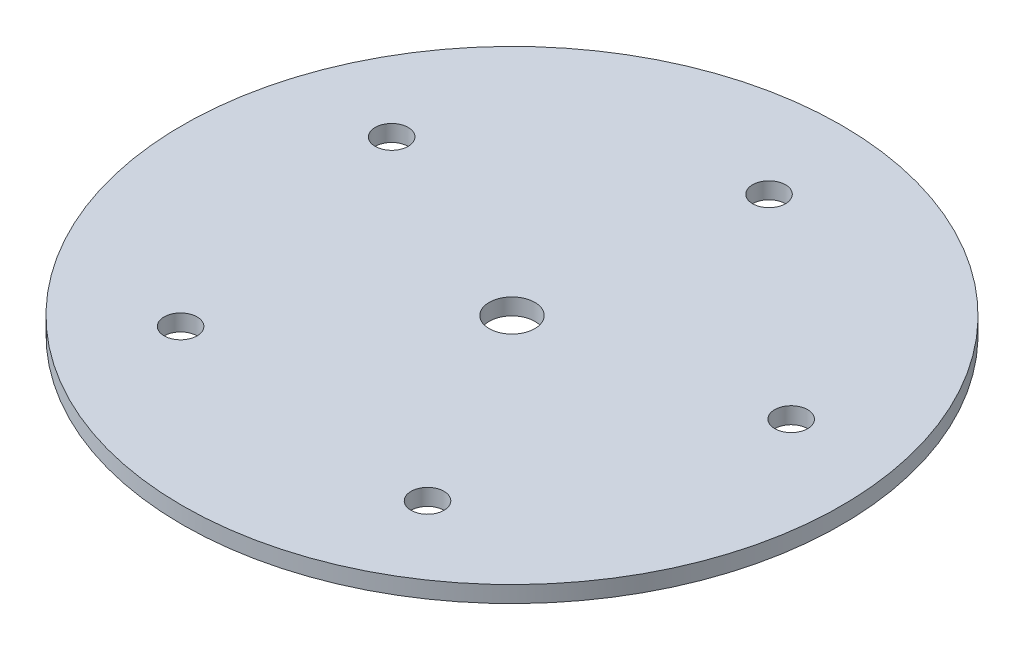
ISO-10303-21;
HEADER;
FILE_DESCRIPTION(('STEP AP214'),'2;1');
FILE_NAME('part.step','',(''),(''),'','','');
FILE_SCHEMA(('AUTOMOTIVE_DESIGN { 1 0 10303 214 1 1 1 1 }'));
ENDSEC;
DATA;
#1=APPLICATION_CONTEXT('core data for automotive mechanical design processes');
#2=APPLICATION_PROTOCOL_DEFINITION('international standard','automotive_design',2000,#1);
#3=PRODUCT_CONTEXT('',#1,'mechanical');
#4=PRODUCT('Part','Part','',(#3));
#5=PRODUCT_RELATED_PRODUCT_CATEGORY('part','',(#4));
#6=PRODUCT_DEFINITION_FORMATION('','',#4);
#7=PRODUCT_DEFINITION_CONTEXT('part definition',#1,'design');
#8=PRODUCT_DEFINITION('design','',#6,#7);
#9=PRODUCT_DEFINITION_SHAPE('','',#8);
#10=(LENGTH_UNIT() NAMED_UNIT(*) SI_UNIT(.MILLI.,.METRE.));
#11=(NAMED_UNIT(*) PLANE_ANGLE_UNIT() SI_UNIT($,.RADIAN.));
#12=(NAMED_UNIT(*) SI_UNIT($,.STERADIAN.) SOLID_ANGLE_UNIT());
#13=UNCERTAINTY_MEASURE_WITH_UNIT(LENGTH_MEASURE(1.E-05),#10,'distance_accuracy_value','');
#14=(GEOMETRIC_REPRESENTATION_CONTEXT(3) GLOBAL_UNCERTAINTY_ASSIGNED_CONTEXT((#13)) GLOBAL_UNIT_ASSIGNED_CONTEXT((#10,
#11,#12)) REPRESENTATION_CONTEXT('',''));
#15=CARTESIAN_POINT('',(0.,0.,0.));
#16=DIRECTION('',(0.,0.,1.));
#17=DIRECTION('',(1.,0.,0.));
#18=AXIS2_PLACEMENT_3D('',#15,#16,#17);
#19=CARTESIAN_POINT('',(0.,3.,0.));
#20=DIRECTION('',(0.,-1.,0.));
#21=DIRECTION('',(0.,0.,-1.));
#22=AXIS2_PLACEMENT_3D('',#19,#20,#21);
#23=CYLINDRICAL_SURFACE('',#22,60.);
#24=CARTESIAN_POINT('',(0.,3.,0.));
#25=DIRECTION('',(0.,1.,0.));
#26=DIRECTION('',(0.,0.,1.));
#27=AXIS2_PLACEMENT_3D('',#24,#25,#26);
#28=CIRCLE('',#27,60.);
#29=CARTESIAN_POINT('',(0.,3.,60.));
#30=VERTEX_POINT('',#29);
#31=EDGE_CURVE('E10',#30,#30,#28,.T.);
#32=ORIENTED_EDGE('',*,*,#31,.F.);
#33=EDGE_LOOP('',(#32));
#34=FACE_BOUND('',#33,.T.);
#35=CARTESIAN_POINT('',(0.,0.,0.));
#36=DIRECTION('',(0.,1.,0.));
#37=DIRECTION('',(0.,0.,1.));
#38=AXIS2_PLACEMENT_3D('',#35,#36,#37);
#39=CIRCLE('',#38,60.);
#40=CARTESIAN_POINT('',(0.,0.,60.));
#41=VERTEX_POINT('',#40);
#42=EDGE_CURVE('E45',#41,#41,#39,.T.);
#43=ORIENTED_EDGE('',*,*,#42,.T.);
#44=EDGE_LOOP('',(#43));
#45=FACE_BOUND('',#44,.T.);
#46=ADVANCED_FACE('F37',(#34,#45),#23,.T.);
#47=CARTESIAN_POINT('',(0.,3.,0.));
#48=DIRECTION('',(0.,1.,0.));
#49=DIRECTION('',(0.,0.,1.));
#50=AXIS2_PLACEMENT_3D('',#47,#48,#49);
#51=PLANE('',#50);
#52=CARTESIAN_POINT('',(21.5307676084281,3.,36.91156861408));
#53=DIRECTION('',(0.,1.,0.));
#54=DIRECTION('',(0.,0.,1.));
#55=AXIS2_PLACEMENT_3D('',#52,#53,#54);
#56=CIRCLE('',#55,3.);
#57=CARTESIAN_POINT('',(21.5307676084281,3.,39.91156861408));
#58=VERTEX_POINT('',#57);
#59=EDGE_CURVE('E152',#58,#58,#56,.T.);
#60=ORIENTED_EDGE('',*,*,#59,.F.);
#61=EDGE_LOOP('',(#60));
#62=FACE_BOUND('',#61,.T.);
#63=CARTESIAN_POINT('',(41.7583609500383,3.,-9.07067484404461));
#64=DIRECTION('',(0.,1.,0.));
#65=DIRECTION('',(0.,0.,1.));
#66=AXIS2_PLACEMENT_3D('',#63,#64,#65);
#67=CIRCLE('',#66,3.);
#68=CARTESIAN_POINT('',(41.7583609500383,3.,-6.07067484404461));
#69=VERTEX_POINT('',#68);
#70=EDGE_CURVE('E146',#69,#69,#67,.T.);
#71=ORIENTED_EDGE('',*,*,#70,.F.);
#72=EDGE_LOOP('',(#71));
#73=FACE_BOUND('',#72,.T.);
#74=CARTESIAN_POINT('',(4.27731877318173,3.,-42.5175539685982));
#75=DIRECTION('',(0.,1.,0.));
#76=DIRECTION('',(0.,0.,1.));
#77=AXIS2_PLACEMENT_3D('',#74,#75,#76);
#78=CIRCLE('',#77,3.);
#79=CARTESIAN_POINT('',(4.27731877318173,3.,-39.5175539685982));
#80=VERTEX_POINT('',#79);
#81=EDGE_CURVE('E140',#80,#80,#78,.T.);
#82=ORIENTED_EDGE('',*,*,#81,.F.);
#83=EDGE_LOOP('',(#82));
#84=FACE_BOUND('',#83,.T.);
#85=CARTESIAN_POINT('',(-39.1148325674941,3.,-17.2066186270568));
#86=DIRECTION('',(0.,1.,0.));
#87=DIRECTION('',(0.,0.,1.));
#88=AXIS2_PLACEMENT_3D('',#85,#86,#87);
#89=CIRCLE('',#88,3.);
#90=CARTESIAN_POINT('',(-39.1148325674941,3.,-14.2066186270568));
#91=VERTEX_POINT('',#90);
#92=EDGE_CURVE('E127',#91,#91,#89,.T.);
#93=ORIENTED_EDGE('',*,*,#92,.F.);
#94=EDGE_LOOP('',(#93));
#95=FACE_BOUND('',#94,.T.);
#96=CARTESIAN_POINT('',(-28.4516147641542,3.,31.8832788256201));
#97=DIRECTION('',(0.,1.,0.));
#98=DIRECTION('',(0.,0.,1.));
#99=AXIS2_PLACEMENT_3D('',#96,#97,#98);
#100=CIRCLE('',#99,3.);
#101=CARTESIAN_POINT('',(-28.4516147641542,3.,34.8832788256201));
#102=VERTEX_POINT('',#101);
#103=EDGE_CURVE('E65',#102,#102,#100,.T.);
#104=ORIENTED_EDGE('',*,*,#103,.F.);
#105=EDGE_LOOP('',(#104));
#106=FACE_BOUND('',#105,.T.);
#107=CARTESIAN_POINT('',(0.,3.,0.));
#108=DIRECTION('',(0.,1.,0.));
#109=DIRECTION('',(0.,0.,1.));
#110=AXIS2_PLACEMENT_3D('',#107,#108,#109);
#111=CIRCLE('',#110,4.15);
#112=CARTESIAN_POINT('',(0.,3.,4.15));
#113=VERTEX_POINT('',#112);
#114=EDGE_CURVE('E54',#113,#113,#111,.T.);
#115=ORIENTED_EDGE('',*,*,#114,.F.);
#116=EDGE_LOOP('',(#115));
#117=FACE_BOUND('',#116,.T.);
#118=ORIENTED_EDGE('',*,*,#31,.T.);
#119=EDGE_LOOP('',(#118));
#120=FACE_BOUND('',#119,.T.);
#121=ADVANCED_FACE('F88',(#62,#73,#84,#95,#106,#117,#120),#51,.T.);
#122=CARTESIAN_POINT('',(0.,0.,0.));
#123=DIRECTION('',(0.,1.,0.));
#124=DIRECTION('',(0.,0.,1.));
#125=AXIS2_PLACEMENT_3D('',#122,#123,#124);
#126=PLANE('',#125);
#127=CARTESIAN_POINT('',(21.5307676084281,0.,36.91156861408));
#128=DIRECTION('',(0.,1.,0.));
#129=DIRECTION('',(0.,0.,1.));
#130=AXIS2_PLACEMENT_3D('',#127,#128,#129);
#131=CIRCLE('',#130,3.);
#132=CARTESIAN_POINT('',(21.5307676084281,0.,39.91156861408));
#133=VERTEX_POINT('',#132);
#134=EDGE_CURVE('E40',#133,#133,#131,.T.);
#135=ORIENTED_EDGE('',*,*,#134,.T.);
#136=EDGE_LOOP('',(#135));
#137=FACE_BOUND('',#136,.T.);
#138=CARTESIAN_POINT('',(41.7583609500383,0.,-9.07067484404461));
#139=DIRECTION('',(0.,1.,0.));
#140=DIRECTION('',(0.,0.,1.));
#141=AXIS2_PLACEMENT_3D('',#138,#139,#140);
#142=CIRCLE('',#141,3.);
#143=CARTESIAN_POINT('',(41.7583609500383,0.,-6.07067484404461));
#144=VERTEX_POINT('',#143);
#145=EDGE_CURVE('E72',#144,#144,#142,.T.);
#146=ORIENTED_EDGE('',*,*,#145,.T.);
#147=EDGE_LOOP('',(#146));
#148=FACE_BOUND('',#147,.T.);
#149=CARTESIAN_POINT('',(4.27731877318173,0.,-42.5175539685982));
#150=DIRECTION('',(0.,1.,0.));
#151=DIRECTION('',(0.,0.,1.));
#152=AXIS2_PLACEMENT_3D('',#149,#150,#151);
#153=CIRCLE('',#152,3.);
#154=CARTESIAN_POINT('',(4.27731877318173,0.,-39.5175539685982));
#155=VERTEX_POINT('',#154);
#156=EDGE_CURVE('E69',#155,#155,#153,.T.);
#157=ORIENTED_EDGE('',*,*,#156,.T.);
#158=EDGE_LOOP('',(#157));
#159=FACE_BOUND('',#158,.T.);
#160=CARTESIAN_POINT('',(-39.1148325674941,0.,-17.2066186270568));
#161=DIRECTION('',(0.,1.,0.));
#162=DIRECTION('',(0.,0.,1.));
#163=AXIS2_PLACEMENT_3D('',#160,#161,#162);
#164=CIRCLE('',#163,3.);
#165=CARTESIAN_POINT('',(-39.1148325674941,0.,-14.2066186270568));
#166=VERTEX_POINT('',#165);
#167=EDGE_CURVE('E64',#166,#166,#164,.T.);
#168=ORIENTED_EDGE('',*,*,#167,.T.);
#169=EDGE_LOOP('',(#168));
#170=FACE_BOUND('',#169,.T.);
#171=CARTESIAN_POINT('',(-28.4516147641542,0.,31.8832788256201));
#172=DIRECTION('',(0.,1.,0.));
#173=DIRECTION('',(0.,0.,1.));
#174=AXIS2_PLACEMENT_3D('',#171,#172,#173);
#175=CIRCLE('',#174,3.);
#176=CARTESIAN_POINT('',(-28.4516147641542,0.,34.8832788256201));
#177=VERTEX_POINT('',#176);
#178=EDGE_CURVE('E60',#177,#177,#175,.T.);
#179=ORIENTED_EDGE('',*,*,#178,.T.);
#180=EDGE_LOOP('',(#179));
#181=FACE_BOUND('',#180,.T.);
#182=CARTESIAN_POINT('',(0.,0.,0.));
#183=DIRECTION('',(0.,1.,0.));
#184=DIRECTION('',(0.,0.,1.));
#185=AXIS2_PLACEMENT_3D('',#182,#183,#184);
#186=CIRCLE('',#185,4.15);
#187=CARTESIAN_POINT('',(0.,0.,4.15));
#188=VERTEX_POINT('',#187);
#189=EDGE_CURVE('E51',#188,#188,#186,.T.);
#190=ORIENTED_EDGE('',*,*,#189,.T.);
#191=EDGE_LOOP('',(#190));
#192=FACE_BOUND('',#191,.T.);
#193=ORIENTED_EDGE('',*,*,#42,.F.);
#194=EDGE_LOOP('',(#193));
#195=FACE_BOUND('',#194,.T.);
#196=ADVANCED_FACE('F90',(#137,#148,#159,#170,#181,#192,#195),#126,.F.);
#197=CARTESIAN_POINT('',(0.,-2.,0.));
#198=DIRECTION('',(0.,1.,0.));
#199=DIRECTION('',(0.,0.,1.));
#200=AXIS2_PLACEMENT_3D('',#197,#198,#199);
#201=CYLINDRICAL_SURFACE('',#200,4.15);
#202=ORIENTED_EDGE('',*,*,#114,.T.);
#203=EDGE_LOOP('',(#202));
#204=FACE_BOUND('',#203,.T.);
#205=ORIENTED_EDGE('',*,*,#189,.F.);
#206=EDGE_LOOP('',(#205));
#207=FACE_BOUND('',#206,.T.);
#208=ADVANCED_FACE('F85',(#204,#207),#201,.F.);
#209=CARTESIAN_POINT('',(-28.4516147641542,-7.,31.8832788256201));
#210=DIRECTION('',(0.,1.,0.));
#211=DIRECTION('',(0.,0.,1.));
#212=AXIS2_PLACEMENT_3D('',#209,#210,#211);
#213=CYLINDRICAL_SURFACE('',#212,3.);
#214=ORIENTED_EDGE('',*,*,#103,.T.);
#215=EDGE_LOOP('',(#214));
#216=FACE_BOUND('',#215,.T.);
#217=ORIENTED_EDGE('',*,*,#178,.F.);
#218=EDGE_LOOP('',(#217));
#219=FACE_BOUND('',#218,.T.);
#220=ADVANCED_FACE('F103',(#216,#219),#213,.F.);
#221=CARTESIAN_POINT('',(-39.1148325674941,-7.,-17.2066186270568));
#222=DIRECTION('',(0.,1.,0.));
#223=DIRECTION('',(0.,0.,1.));
#224=AXIS2_PLACEMENT_3D('',#221,#222,#223);
#225=CYLINDRICAL_SURFACE('',#224,3.);
#226=ORIENTED_EDGE('',*,*,#92,.T.);
#227=EDGE_LOOP('',(#226));
#228=FACE_BOUND('',#227,.T.);
#229=ORIENTED_EDGE('',*,*,#167,.F.);
#230=EDGE_LOOP('',(#229));
#231=FACE_BOUND('',#230,.T.);
#232=ADVANCED_FACE('F106',(#228,#231),#225,.F.);
#233=CARTESIAN_POINT('',(4.27731877318173,-7.,-42.5175539685982));
#234=DIRECTION('',(0.,1.,0.));
#235=DIRECTION('',(0.,0.,1.));
#236=AXIS2_PLACEMENT_3D('',#233,#234,#235);
#237=CYLINDRICAL_SURFACE('',#236,3.);
#238=ORIENTED_EDGE('',*,*,#81,.T.);
#239=EDGE_LOOP('',(#238));
#240=FACE_BOUND('',#239,.T.);
#241=ORIENTED_EDGE('',*,*,#156,.F.);
#242=EDGE_LOOP('',(#241));
#243=FACE_BOUND('',#242,.T.);
#244=ADVANCED_FACE('F115',(#240,#243),#237,.F.);
#245=CARTESIAN_POINT('',(41.7583609500383,-7.,-9.07067484404461));
#246=DIRECTION('',(0.,1.,0.));
#247=DIRECTION('',(0.,0.,1.));
#248=AXIS2_PLACEMENT_3D('',#245,#246,#247);
#249=CYLINDRICAL_SURFACE('',#248,3.);
#250=ORIENTED_EDGE('',*,*,#70,.T.);
#251=EDGE_LOOP('',(#250));
#252=FACE_BOUND('',#251,.T.);
#253=ORIENTED_EDGE('',*,*,#145,.F.);
#254=EDGE_LOOP('',(#253));
#255=FACE_BOUND('',#254,.T.);
#256=ADVANCED_FACE('F111',(#252,#255),#249,.F.);
#257=CARTESIAN_POINT('',(21.5307676084281,-7.,36.91156861408));
#258=DIRECTION('',(0.,1.,0.));
#259=DIRECTION('',(0.,0.,1.));
#260=AXIS2_PLACEMENT_3D('',#257,#258,#259);
#261=CYLINDRICAL_SURFACE('',#260,3.);
#262=ORIENTED_EDGE('',*,*,#59,.T.);
#263=EDGE_LOOP('',(#262));
#264=FACE_BOUND('',#263,.T.);
#265=ORIENTED_EDGE('',*,*,#134,.F.);
#266=EDGE_LOOP('',(#265));
#267=FACE_BOUND('',#266,.T.);
#268=ADVANCED_FACE('F108',(#264,#267),#261,.F.);
#269=CLOSED_SHELL('',(#46,#121,#196,#208,#220,#232,#244,#256,#268));
#270=MANIFOLD_SOLID_BREP('B2',#269);
#271=ADVANCED_BREP_SHAPE_REPRESENTATION('',(#18,#270),#14);
#272=SHAPE_DEFINITION_REPRESENTATION(#9,#271);
ENDSEC;
END-ISO-10303-21;
